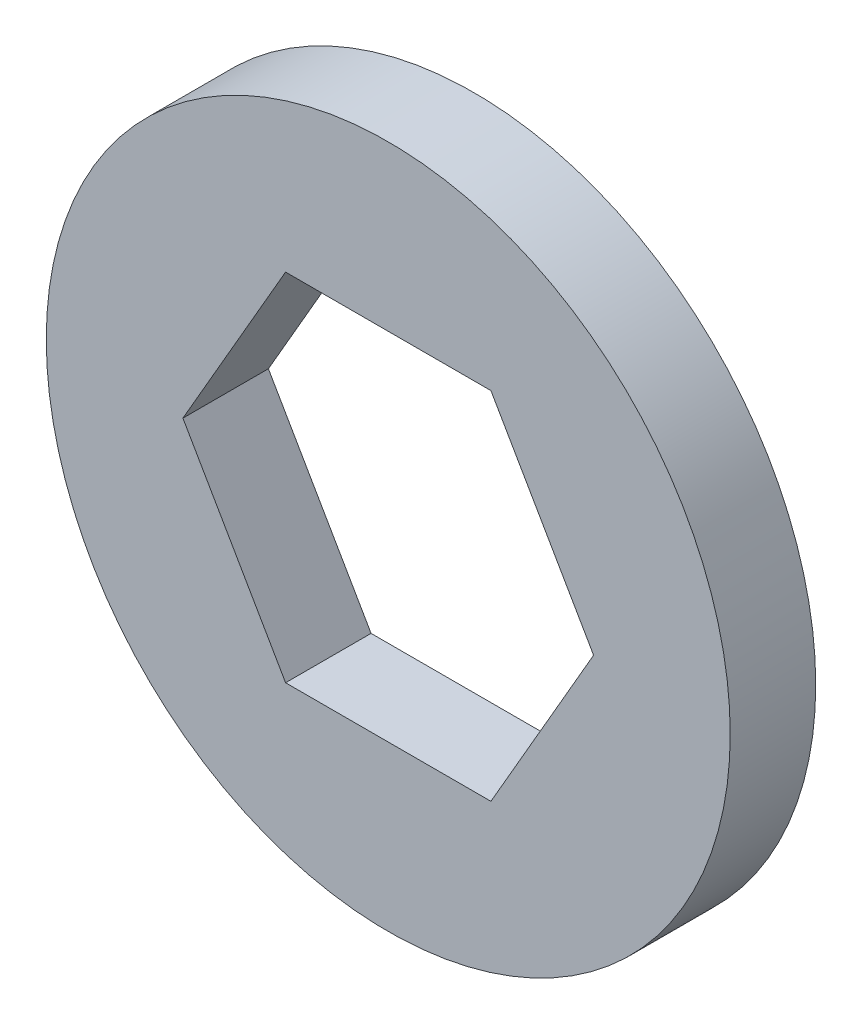
ISO-10303-21;
HEADER;
FILE_DESCRIPTION(('STEP AP214'),'2;1');
FILE_NAME('part.step','',(''),(''),'','','');
FILE_SCHEMA(('AUTOMOTIVE_DESIGN { 1 0 10303 214 1 1 1 1 }'));
ENDSEC;
DATA;
#1=APPLICATION_CONTEXT('core data for automotive mechanical design processes');
#2=APPLICATION_PROTOCOL_DEFINITION('international standard','automotive_design',2000,#1);
#3=PRODUCT_CONTEXT('',#1,'mechanical');
#4=PRODUCT('Part','Part','',(#3));
#5=PRODUCT_RELATED_PRODUCT_CATEGORY('part','',(#4));
#6=PRODUCT_DEFINITION_FORMATION('','',#4);
#7=PRODUCT_DEFINITION_CONTEXT('part definition',#1,'design');
#8=PRODUCT_DEFINITION('design','',#6,#7);
#9=PRODUCT_DEFINITION_SHAPE('','',#8);
#10=(LENGTH_UNIT() NAMED_UNIT(*) SI_UNIT(.MILLI.,.METRE.));
#11=(NAMED_UNIT(*) PLANE_ANGLE_UNIT() SI_UNIT($,.RADIAN.));
#12=(NAMED_UNIT(*) SI_UNIT($,.STERADIAN.) SOLID_ANGLE_UNIT());
#13=UNCERTAINTY_MEASURE_WITH_UNIT(LENGTH_MEASURE(1.E-05),#10,'distance_accuracy_value','');
#14=(GEOMETRIC_REPRESENTATION_CONTEXT(3) GLOBAL_UNCERTAINTY_ASSIGNED_CONTEXT((#13)) GLOBAL_UNIT_ASSIGNED_CONTEXT((#10,
#11,#12)) REPRESENTATION_CONTEXT('',''));
#15=CARTESIAN_POINT('',(0.,0.,0.));
#16=DIRECTION('',(0.,0.,1.));
#17=DIRECTION('',(1.,0.,0.));
#18=AXIS2_PLACEMENT_3D('',#15,#16,#17);
#19=CARTESIAN_POINT('',(0.,0.,3.175));
#20=DIRECTION('',(0.,0.,1.));
#21=DIRECTION('',(1.,0.,0.));
#22=AXIS2_PLACEMENT_3D('',#19,#20,#21);
#23=PLANE('',#22);
#24=CARTESIAN_POINT('',(0.,0.,3.175));
#25=DIRECTION('',(0.,0.,1.));
#26=DIRECTION('',(1.,0.,0.));
#27=AXIS2_PLACEMENT_3D('',#24,#25,#26);
#28=CIRCLE('',#27,12.7);
#29=CARTESIAN_POINT('',(12.7,0.,3.175));
#30=VERTEX_POINT('',#29);
#31=EDGE_CURVE('E11',#30,#30,#28,.T.);
#32=ORIENTED_EDGE('',*,*,#31,.T.);
#33=EDGE_LOOP('',(#32));
#34=FACE_BOUND('',#33,.T.);
#35=DIRECTION('',(0.5,0.866025403784438,0.));
#36=VECTOR('',#35,1.);
#37=CARTESIAN_POINT('',(3.81282117772829,-6.604,3.175));
#38=LINE('',#37,#36);
#39=CARTESIAN_POINT('',(3.81282117772829,-6.604,3.175));
#40=VERTEX_POINT('',#39);
#41=CARTESIAN_POINT('',(7.62564235545658,0.,3.175));
#42=VERTEX_POINT('',#41);
#43=EDGE_CURVE('E98',#40,#42,#38,.T.);
#44=ORIENTED_EDGE('',*,*,#43,.F.);
#45=DIRECTION('',(1.,0.,0.));
#46=VECTOR('',#45,1.);
#47=CARTESIAN_POINT('',(-3.81282117772829,-6.604,3.175));
#48=LINE('',#47,#46);
#49=CARTESIAN_POINT('',(-3.81282117772829,-6.604,3.175));
#50=VERTEX_POINT('',#49);
#51=EDGE_CURVE('E90',#50,#40,#48,.T.);
#52=ORIENTED_EDGE('',*,*,#51,.F.);
#53=DIRECTION('',(0.5,-0.866025403784439,0.));
#54=VECTOR('',#53,1.);
#55=CARTESIAN_POINT('',(-7.62564235545658,0.,3.175));
#56=LINE('',#55,#54);
#57=CARTESIAN_POINT('',(-7.62564235545658,0.,3.175));
#58=VERTEX_POINT('',#57);
#59=EDGE_CURVE('E118',#58,#50,#56,.T.);
#60=ORIENTED_EDGE('',*,*,#59,.F.);
#61=DIRECTION('',(-0.5,-0.866025403784438,0.));
#62=VECTOR('',#61,1.);
#63=CARTESIAN_POINT('',(-3.81282117772829,6.604,3.175));
#64=LINE('',#63,#62);
#65=CARTESIAN_POINT('',(-3.81282117772829,6.604,3.175));
#66=VERTEX_POINT('',#65);
#67=EDGE_CURVE('E116',#66,#58,#64,.T.);
#68=ORIENTED_EDGE('',*,*,#67,.F.);
#69=DIRECTION('',(-1.,0.,0.));
#70=VECTOR('',#69,1.);
#71=CARTESIAN_POINT('',(3.81282117772829,6.604,3.175));
#72=LINE('',#71,#70);
#73=CARTESIAN_POINT('',(3.81282117772829,6.604,3.175));
#74=VERTEX_POINT('',#73);
#75=EDGE_CURVE('E112',#74,#66,#72,.T.);
#76=ORIENTED_EDGE('',*,*,#75,.F.);
#77=DIRECTION('',(-0.5,0.866025403784439,0.));
#78=VECTOR('',#77,1.);
#79=CARTESIAN_POINT('',(7.62564235545658,0.,3.175));
#80=LINE('',#79,#78);
#81=EDGE_CURVE('E110',#42,#74,#80,.T.);
#82=ORIENTED_EDGE('',*,*,#81,.F.);
#83=EDGE_LOOP('',(#44,#52,#60,#68,#76,#82));
#84=FACE_BOUND('',#83,.T.);
#85=ADVANCED_FACE('F37',(#34,#84),#23,.T.);
#86=CARTESIAN_POINT('',(0.,0.,0.));
#87=DIRECTION('',(0.,0.,1.));
#88=DIRECTION('',(1.,0.,0.));
#89=AXIS2_PLACEMENT_3D('',#86,#87,#88);
#90=PLANE('',#89);
#91=CARTESIAN_POINT('',(0.,0.,0.));
#92=DIRECTION('',(0.,0.,1.));
#93=DIRECTION('',(1.,0.,0.));
#94=AXIS2_PLACEMENT_3D('',#91,#92,#93);
#95=CIRCLE('',#94,12.7);
#96=CARTESIAN_POINT('',(12.7,0.,0.));
#97=VERTEX_POINT('',#96);
#98=EDGE_CURVE('E41',#97,#97,#95,.T.);
#99=ORIENTED_EDGE('',*,*,#98,.F.);
#100=EDGE_LOOP('',(#99));
#101=FACE_BOUND('',#100,.T.);
#102=DIRECTION('',(1.,0.,0.));
#103=VECTOR('',#102,1.);
#104=CARTESIAN_POINT('',(-3.81282117772829,-6.604,0.));
#105=LINE('',#104,#103);
#106=CARTESIAN_POINT('',(-3.81282117772829,-6.604,0.));
#107=VERTEX_POINT('',#106);
#108=CARTESIAN_POINT('',(3.81282117772829,-6.604,0.));
#109=VERTEX_POINT('',#108);
#110=EDGE_CURVE('E60',#107,#109,#105,.T.);
#111=ORIENTED_EDGE('',*,*,#110,.T.);
#112=DIRECTION('',(0.5,0.866025403784438,0.));
#113=VECTOR('',#112,1.);
#114=CARTESIAN_POINT('',(3.81282117772829,-6.604,0.));
#115=LINE('',#114,#113);
#116=CARTESIAN_POINT('',(7.62564235545658,0.,0.));
#117=VERTEX_POINT('',#116);
#118=EDGE_CURVE('E105',#109,#117,#115,.T.);
#119=ORIENTED_EDGE('',*,*,#118,.T.);
#120=DIRECTION('',(-0.5,0.866025403784439,0.));
#121=VECTOR('',#120,1.);
#122=CARTESIAN_POINT('',(7.62564235545658,0.,0.));
#123=LINE('',#122,#121);
#124=CARTESIAN_POINT('',(3.81282117772829,6.604,0.));
#125=VERTEX_POINT('',#124);
#126=EDGE_CURVE('E122',#117,#125,#123,.T.);
#127=ORIENTED_EDGE('',*,*,#126,.T.);
#128=DIRECTION('',(-1.,0.,0.));
#129=VECTOR('',#128,1.);
#130=CARTESIAN_POINT('',(3.81282117772829,6.604,0.));
#131=LINE('',#130,#129);
#132=CARTESIAN_POINT('',(-3.81282117772829,6.604,0.));
#133=VERTEX_POINT('',#132);
#134=EDGE_CURVE('E125',#125,#133,#131,.T.);
#135=ORIENTED_EDGE('',*,*,#134,.T.);
#136=DIRECTION('',(-0.5,-0.866025403784438,0.));
#137=VECTOR('',#136,1.);
#138=CARTESIAN_POINT('',(-3.81282117772829,6.604,0.));
#139=LINE('',#138,#137);
#140=CARTESIAN_POINT('',(-7.62564235545658,0.,0.));
#141=VERTEX_POINT('',#140);
#142=EDGE_CURVE('E128',#133,#141,#139,.T.);
#143=ORIENTED_EDGE('',*,*,#142,.T.);
#144=DIRECTION('',(0.5,-0.866025403784439,0.));
#145=VECTOR('',#144,1.);
#146=CARTESIAN_POINT('',(-7.62564235545658,0.,0.));
#147=LINE('',#146,#145);
#148=EDGE_CURVE('E99',#141,#107,#147,.T.);
#149=ORIENTED_EDGE('',*,*,#148,.T.);
#150=EDGE_LOOP('',(#111,#119,#127,#135,#143,#149));
#151=FACE_BOUND('',#150,.T.);
#152=ADVANCED_FACE('F145',(#101,#151),#90,.F.);
#153=CARTESIAN_POINT('',(0.,0.,3.175));
#154=DIRECTION('',(0.,0.,-1.));
#155=DIRECTION('',(-1.,0.,0.));
#156=AXIS2_PLACEMENT_3D('',#153,#154,#155);
#157=CYLINDRICAL_SURFACE('',#156,12.7);
#158=ORIENTED_EDGE('',*,*,#31,.F.);
#159=EDGE_LOOP('',(#158));
#160=FACE_BOUND('',#159,.T.);
#161=ORIENTED_EDGE('',*,*,#98,.T.);
#162=EDGE_LOOP('',(#161));
#163=FACE_BOUND('',#162,.T.);
#164=ADVANCED_FACE('F39',(#160,#163),#157,.T.);
#165=CARTESIAN_POINT('',(-3.81282117772829,-6.604,3.175));
#166=DIRECTION('',(0.,1.,0.));
#167=DIRECTION('',(0.,0.,1.));
#168=AXIS2_PLACEMENT_3D('',#165,#166,#167);
#169=PLANE('',#168);
#170=ORIENTED_EDGE('',*,*,#110,.F.);
#171=DIRECTION('',(0.,0.,-1.));
#172=VECTOR('',#171,1.);
#173=CARTESIAN_POINT('',(-3.81282117772829,-6.604,3.175));
#174=LINE('',#173,#172);
#175=EDGE_CURVE('E94',#50,#107,#174,.T.);
#176=ORIENTED_EDGE('',*,*,#175,.F.);
#177=ORIENTED_EDGE('',*,*,#51,.T.);
#178=DIRECTION('',(0.,0.,-1.));
#179=VECTOR('',#178,1.);
#180=CARTESIAN_POINT('',(3.81282117772829,-6.604,3.175));
#181=LINE('',#180,#179);
#182=EDGE_CURVE('E93',#40,#109,#181,.T.);
#183=ORIENTED_EDGE('',*,*,#182,.T.);
#184=EDGE_LOOP('',(#170,#176,#177,#183));
#185=FACE_BOUND('',#184,.T.);
#186=ADVANCED_FACE('F92',(#185),#169,.T.);
#187=CARTESIAN_POINT('',(3.81282117772829,-6.604,3.175));
#188=DIRECTION('',(-0.866025403784438,0.5,0.));
#189=DIRECTION('',(-0.5,-0.866025403784439,0.));
#190=AXIS2_PLACEMENT_3D('',#187,#188,#189);
#191=PLANE('',#190);
#192=ORIENTED_EDGE('',*,*,#118,.F.);
#193=ORIENTED_EDGE('',*,*,#182,.F.);
#194=ORIENTED_EDGE('',*,*,#43,.T.);
#195=DIRECTION('',(0.,0.,-1.));
#196=VECTOR('',#195,1.);
#197=CARTESIAN_POINT('',(7.62564235545658,0.,3.175));
#198=LINE('',#197,#196);
#199=EDGE_CURVE('E106',#42,#117,#198,.T.);
#200=ORIENTED_EDGE('',*,*,#199,.T.);
#201=EDGE_LOOP('',(#192,#193,#194,#200));
#202=FACE_BOUND('',#201,.T.);
#203=ADVANCED_FACE('F102',(#202),#191,.T.);
#204=CARTESIAN_POINT('',(7.62564235545658,0.,3.175));
#205=DIRECTION('',(-0.866025403784439,-0.5,0.));
#206=DIRECTION('',(0.5,-0.866025403784439,0.));
#207=AXIS2_PLACEMENT_3D('',#204,#205,#206);
#208=PLANE('',#207);
#209=ORIENTED_EDGE('',*,*,#126,.F.);
#210=ORIENTED_EDGE('',*,*,#199,.F.);
#211=ORIENTED_EDGE('',*,*,#81,.T.);
#212=DIRECTION('',(0.,0.,-1.));
#213=VECTOR('',#212,1.);
#214=CARTESIAN_POINT('',(3.81282117772829,6.604,3.175));
#215=LINE('',#214,#213);
#216=EDGE_CURVE('E137',#74,#125,#215,.T.);
#217=ORIENTED_EDGE('',*,*,#216,.T.);
#218=EDGE_LOOP('',(#209,#210,#211,#217));
#219=FACE_BOUND('',#218,.T.);
#220=ADVANCED_FACE('F141',(#219),#208,.T.);
#221=CARTESIAN_POINT('',(3.81282117772829,6.604,3.175));
#222=DIRECTION('',(0.,-1.,0.));
#223=DIRECTION('',(1.,0.,0.));
#224=AXIS2_PLACEMENT_3D('',#221,#222,#223);
#225=PLANE('',#224);
#226=ORIENTED_EDGE('',*,*,#134,.F.);
#227=ORIENTED_EDGE('',*,*,#216,.F.);
#228=ORIENTED_EDGE('',*,*,#75,.T.);
#229=DIRECTION('',(0.,0.,-1.));
#230=VECTOR('',#229,1.);
#231=CARTESIAN_POINT('',(-3.81282117772829,6.604,3.175));
#232=LINE('',#231,#230);
#233=EDGE_CURVE('E135',#66,#133,#232,.T.);
#234=ORIENTED_EDGE('',*,*,#233,.T.);
#235=EDGE_LOOP('',(#226,#227,#228,#234));
#236=FACE_BOUND('',#235,.T.);
#237=ADVANCED_FACE('F153',(#236),#225,.T.);
#238=CARTESIAN_POINT('',(-3.81282117772829,6.604,3.175));
#239=DIRECTION('',(0.866025403784438,-0.5,0.));
#240=DIRECTION('',(0.5,0.866025403784439,0.));
#241=AXIS2_PLACEMENT_3D('',#238,#239,#240);
#242=PLANE('',#241);
#243=ORIENTED_EDGE('',*,*,#142,.F.);
#244=ORIENTED_EDGE('',*,*,#233,.F.);
#245=ORIENTED_EDGE('',*,*,#67,.T.);
#246=DIRECTION('',(0.,0.,-1.));
#247=VECTOR('',#246,1.);
#248=CARTESIAN_POINT('',(-7.62564235545658,0.,3.175));
#249=LINE('',#248,#247);
#250=EDGE_CURVE('E52',#58,#141,#249,.T.);
#251=ORIENTED_EDGE('',*,*,#250,.T.);
#252=EDGE_LOOP('',(#243,#244,#245,#251));
#253=FACE_BOUND('',#252,.T.);
#254=ADVANCED_FACE('F151',(#253),#242,.T.);
#255=CARTESIAN_POINT('',(-7.62564235545658,0.,3.175));
#256=DIRECTION('',(0.866025403784439,0.5,0.));
#257=DIRECTION('',(-0.5,0.866025403784439,0.));
#258=AXIS2_PLACEMENT_3D('',#255,#256,#257);
#259=PLANE('',#258);
#260=ORIENTED_EDGE('',*,*,#148,.F.);
#261=ORIENTED_EDGE('',*,*,#250,.F.);
#262=ORIENTED_EDGE('',*,*,#59,.T.);
#263=ORIENTED_EDGE('',*,*,#175,.T.);
#264=EDGE_LOOP('',(#260,#261,#262,#263));
#265=FACE_BOUND('',#264,.T.);
#266=ADVANCED_FACE('F147',(#265),#259,.T.);
#267=CLOSED_SHELL('',(#85,#152,#164,#186,#203,#220,#237,#254,#266));
#268=MANIFOLD_SOLID_BREP('B2',#267);
#269=ADVANCED_BREP_SHAPE_REPRESENTATION('',(#18,#268),#14);
#270=SHAPE_DEFINITION_REPRESENTATION(#9,#269);
ENDSEC;
END-ISO-10303-21;
